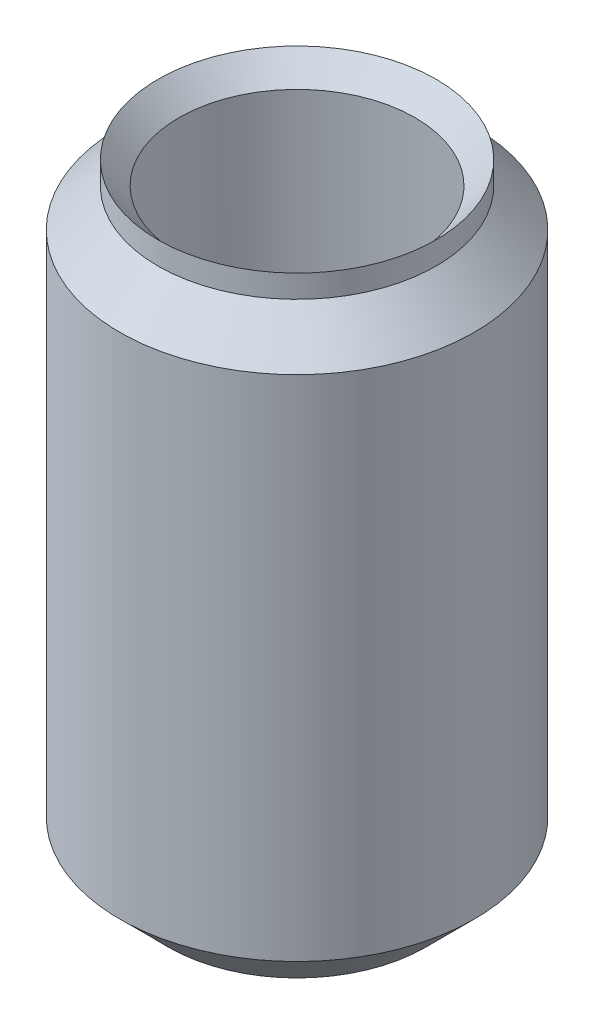
ISO-10303-21;
HEADER;
FILE_DESCRIPTION(('STEP AP214'),'2;1');
FILE_NAME('part.step','',(''),(''),'','','');
FILE_SCHEMA(('AUTOMOTIVE_DESIGN { 1 0 10303 214 1 1 1 1 }'));
ENDSEC;
DATA;
#1=APPLICATION_CONTEXT('core data for automotive mechanical design processes');
#2=APPLICATION_PROTOCOL_DEFINITION('international standard','automotive_design',2000,#1);
#3=PRODUCT_CONTEXT('',#1,'mechanical');
#4=PRODUCT('Part','Part','',(#3));
#5=PRODUCT_RELATED_PRODUCT_CATEGORY('part','',(#4));
#6=PRODUCT_DEFINITION_FORMATION('','',#4);
#7=PRODUCT_DEFINITION_CONTEXT('part definition',#1,'design');
#8=PRODUCT_DEFINITION('design','',#6,#7);
#9=PRODUCT_DEFINITION_SHAPE('','',#8);
#10=(LENGTH_UNIT() NAMED_UNIT(*) SI_UNIT(.MILLI.,.METRE.));
#11=(NAMED_UNIT(*) PLANE_ANGLE_UNIT() SI_UNIT($,.RADIAN.));
#12=(NAMED_UNIT(*) SI_UNIT($,.STERADIAN.) SOLID_ANGLE_UNIT());
#13=UNCERTAINTY_MEASURE_WITH_UNIT(LENGTH_MEASURE(1.E-05),#10,'distance_accuracy_value','');
#14=(GEOMETRIC_REPRESENTATION_CONTEXT(3) GLOBAL_UNCERTAINTY_ASSIGNED_CONTEXT((#13)) GLOBAL_UNIT_ASSIGNED_CONTEXT((#10,
#11,#12)) REPRESENTATION_CONTEXT('',''));
#15=CARTESIAN_POINT('',(0.,0.,0.));
#16=DIRECTION('',(0.,0.,1.));
#17=DIRECTION('',(1.,0.,0.));
#18=AXIS2_PLACEMENT_3D('',#15,#16,#17);
#19=CARTESIAN_POINT('',(-13.89845810231,54.0402416133194,0.));
#20=DIRECTION('',(0.,1.,0.));
#21=DIRECTION('',(0.,0.,1.));
#22=AXIS2_PLACEMENT_3D('',#19,#20,#21);
#23=CONICAL_SURFACE('',#22,21.8360141846749,0.747471825088293);
#24=CARTESIAN_POINT('',(-13.89845810231,58.2402416133193,0.));
#25=DIRECTION('',(0.,-1.,0.));
#26=DIRECTION('',(0.,0.,-1.));
#27=AXIS2_PLACEMENT_3D('',#24,#25,#26);
#28=CIRCLE('',#27,25.7289321881345);
#29=CARTESIAN_POINT('',(-13.89845810231,58.2402416133193,-25.7289321881345));
#30=VERTEX_POINT('',#29);
#31=EDGE_CURVE('E10',#30,#30,#28,.T.);
#32=ORIENTED_EDGE('',*,*,#31,.F.);
#33=EDGE_LOOP('',(#32));
#34=FACE_BOUND('',#33,.T.);
#35=CARTESIAN_POINT('',(-13.89845810231,54.0402416133194,0.));
#36=DIRECTION('',(0.,-1.,0.));
#37=DIRECTION('',(0.,0.,-1.));
#38=AXIS2_PLACEMENT_3D('',#35,#36,#37);
#39=CIRCLE('',#38,21.8360141846749);
#40=CARTESIAN_POINT('',(-13.89845810231,54.0402416133194,-21.8360141846749));
#41=VERTEX_POINT('',#40);
#42=EDGE_CURVE('E34',#41,#41,#39,.T.);
#43=ORIENTED_EDGE('',*,*,#42,.T.);
#44=EDGE_LOOP('',(#43));
#45=FACE_BOUND('',#44,.T.);
#46=ADVANCED_FACE('F31',(#34,#45),#23,.F.);
#47=CARTESIAN_POINT('',(-13.89845810231,-46.3527399541551,0.));
#48=DIRECTION('',(0.,-1.,0.));
#49=DIRECTION('',(0.,0.,-1.));
#50=AXIS2_PLACEMENT_3D('',#47,#48,#49);
#51=CYLINDRICAL_SURFACE('',#50,25.7289321881345);
#52=CARTESIAN_POINT('',(-13.89845810231,54.0402416133193,0.));
#53=DIRECTION('',(0.,-1.,0.));
#54=DIRECTION('',(0.,0.,-1.));
#55=AXIS2_PLACEMENT_3D('',#52,#53,#54);
#56=CIRCLE('',#55,25.7289321881345);
#57=CARTESIAN_POINT('',(-13.89845810231,54.0402416133193,-25.7289321881345));
#58=VERTEX_POINT('',#57);
#59=EDGE_CURVE('E38',#58,#58,#56,.T.);
#60=ORIENTED_EDGE('',*,*,#59,.F.);
#61=EDGE_LOOP('',(#60));
#62=FACE_BOUND('',#61,.T.);
#63=ORIENTED_EDGE('',*,*,#31,.T.);
#64=EDGE_LOOP('',(#63));
#65=FACE_BOUND('',#64,.T.);
#66=ADVANCED_FACE('F99',(#62,#65),#51,.T.);
#67=CARTESIAN_POINT('',(-13.89845810231,54.0402416133193,0.));
#68=DIRECTION('',(0.,-1.,0.));
#69=DIRECTION('',(0.,0.,-1.));
#70=AXIS2_PLACEMENT_3D('',#67,#68,#69);
#71=CONICAL_SURFACE('',#70,25.7289321881345,0.785398163397447);
#72=CARTESIAN_POINT('',(-13.89845810231,46.9691738014538,0.));
#73=DIRECTION('',(0.,-1.,0.));
#74=DIRECTION('',(0.,0.,-1.));
#75=AXIS2_PLACEMENT_3D('',#72,#73,#74);
#76=CIRCLE('',#75,32.8);
#77=CARTESIAN_POINT('',(-13.89845810231,46.9691738014538,-32.8));
#78=VERTEX_POINT('',#77);
#79=EDGE_CURVE('E42',#78,#78,#76,.T.);
#80=ORIENTED_EDGE('',*,*,#79,.F.);
#81=EDGE_LOOP('',(#80));
#82=FACE_BOUND('',#81,.T.);
#83=ORIENTED_EDGE('',*,*,#59,.T.);
#84=EDGE_LOOP('',(#83));
#85=FACE_BOUND('',#84,.T.);
#86=ADVANCED_FACE('F104',(#82,#85),#71,.T.);
#87=CARTESIAN_POINT('',(-13.89845810231,-46.3527399541551,0.));
#88=DIRECTION('',(0.,-1.,0.));
#89=DIRECTION('',(0.,0.,-1.));
#90=AXIS2_PLACEMENT_3D('',#87,#88,#89);
#91=CYLINDRICAL_SURFACE('',#90,32.8);
#92=CARTESIAN_POINT('',(-13.89845810231,-47.0308261985462,0.));
#93=DIRECTION('',(0.,-1.,0.));
#94=DIRECTION('',(0.,0.,-1.));
#95=AXIS2_PLACEMENT_3D('',#92,#93,#94);
#96=CIRCLE('',#95,32.8);
#97=CARTESIAN_POINT('',(-13.89845810231,-47.0308261985462,-32.8));
#98=VERTEX_POINT('',#97);
#99=EDGE_CURVE('E47',#98,#98,#96,.T.);
#100=ORIENTED_EDGE('',*,*,#99,.F.);
#101=EDGE_LOOP('',(#100));
#102=FACE_BOUND('',#101,.T.);
#103=ORIENTED_EDGE('',*,*,#79,.T.);
#104=EDGE_LOOP('',(#103));
#105=FACE_BOUND('',#104,.T.);
#106=ADVANCED_FACE('F138',(#102,#105),#91,.T.);
#107=CARTESIAN_POINT('',(-13.89845810231,-47.0308261985462,0.));
#108=DIRECTION('',(0.,1.,0.));
#109=DIRECTION('',(0.,0.,1.));
#110=AXIS2_PLACEMENT_3D('',#107,#108,#109);
#111=CONICAL_SURFACE('',#110,32.8,0.78539816339745);
#112=CARTESIAN_POINT('',(-13.89845810231,-56.0308261985462,0.));
#113=DIRECTION('',(0.,-1.,0.));
#114=DIRECTION('',(0.,0.,-1.));
#115=AXIS2_PLACEMENT_3D('',#112,#113,#114);
#116=CIRCLE('',#115,23.7999999999999);
#117=CARTESIAN_POINT('',(-13.89845810231,-56.0308261985462,-23.7999999999999));
#118=VERTEX_POINT('',#117);
#119=EDGE_CURVE('E50',#118,#118,#116,.T.);
#120=ORIENTED_EDGE('',*,*,#119,.F.);
#121=EDGE_LOOP('',(#120));
#122=FACE_BOUND('',#121,.T.);
#123=ORIENTED_EDGE('',*,*,#99,.T.);
#124=EDGE_LOOP('',(#123));
#125=FACE_BOUND('',#124,.T.);
#126=ADVANCED_FACE('F134',(#122,#125),#111,.T.);
#127=CARTESIAN_POINT('',(-13.89845810231,-56.0308261985462,0.));
#128=DIRECTION('',(0.,-1.,0.));
#129=DIRECTION('',(0.,0.,-1.));
#130=AXIS2_PLACEMENT_3D('',#127,#128,#129);
#131=CONICAL_SURFACE('',#130,23.7999999999999,0.546566963812856);
#132=CARTESIAN_POINT('',(-13.89845810231,-55.9575918137394,0.));
#133=DIRECTION('',(0.,-1.,0.));
#134=DIRECTION('',(0.,0.,-1.));
#135=AXIS2_PLACEMENT_3D('',#132,#133,#134);
#136=CIRCLE('',#135,23.7554448148378);
#137=CARTESIAN_POINT('',(-13.89845810231,-55.9575918137394,-23.7554448148378));
#138=VERTEX_POINT('',#137);
#139=EDGE_CURVE('E53',#138,#138,#136,.T.);
#140=ORIENTED_EDGE('',*,*,#139,.F.);
#141=EDGE_LOOP('',(#140));
#142=FACE_BOUND('',#141,.T.);
#143=ORIENTED_EDGE('',*,*,#119,.T.);
#144=EDGE_LOOP('',(#143));
#145=FACE_BOUND('',#144,.T.);
#146=ADVANCED_FACE('F125',(#142,#145),#131,.F.);
#147=CARTESIAN_POINT('',(-13.89845810231,-66.3527399541552,0.));
#148=DIRECTION('',(0.,-1.,0.));
#149=DIRECTION('',(0.,0.,-1.));
#150=AXIS2_PLACEMENT_3D('',#147,#148,#149);
#151=DEGENERATE_TOROIDAL_SURFACE('',#150,6.66916683691617,20.,.T.);
#152=CARTESIAN_POINT('',(-13.89845810231,-46.3527399541552,0.));
#153=DIRECTION('',(0.,-1.,0.));
#154=DIRECTION('',(0.,0.,-1.));
#155=AXIS2_PLACEMENT_3D('',#152,#153,#154);
#156=CIRCLE('',#155,6.66916683691611);
#157=CARTESIAN_POINT('',(-13.89845810231,-46.3527399541552,-6.66916683691611));
#158=VERTEX_POINT('',#157);
#159=EDGE_CURVE('E56',#158,#158,#156,.T.);
#160=ORIENTED_EDGE('',*,*,#159,.F.);
#161=EDGE_LOOP('',(#160));
#162=FACE_BOUND('',#161,.T.);
#163=ORIENTED_EDGE('',*,*,#139,.T.);
#164=EDGE_LOOP('',(#163));
#165=FACE_BOUND('',#164,.T.);
#166=ADVANCED_FACE('F119',(#162,#165),#151,.F.);
#167=CARTESIAN_POINT('',(-20.5676249392261,-46.3527399541552,0.));
#168=DIRECTION('',(0.,1.,0.));
#169=DIRECTION('',(0.,0.,1.));
#170=AXIS2_PLACEMENT_3D('',#167,#168,#169);
#171=PLANE('',#170);
#172=ORIENTED_EDGE('',*,*,#159,.T.);
#173=EDGE_LOOP('',(#172));
#174=FACE_BOUND('',#173,.T.);
#175=ADVANCED_FACE('F112',(#174),#171,.F.);
#176=CARTESIAN_POINT('',(-13.89845810231,54.0402416133194,0.));
#177=DIRECTION('',(0.,-1.,0.));
#178=DIRECTION('',(0.,0.,-1.));
#179=AXIS2_PLACEMENT_3D('',#176,#177,#178);
#180=PLANE('',#179);
#181=ORIENTED_EDGE('',*,*,#42,.F.);
#182=EDGE_LOOP('',(#181));
#183=FACE_BOUND('',#182,.T.);
#184=CARTESIAN_POINT('',(-13.89845810231,54.0402416133194,0.));
#185=DIRECTION('',(0.,-1.,0.));
#186=DIRECTION('',(0.,0.,-1.));
#187=AXIS2_PLACEMENT_3D('',#184,#185,#186);
#188=CIRCLE('',#187,21.9859985391194);
#189=CARTESIAN_POINT('',(-13.89845810231,54.0402416133194,-21.9859985391194));
#190=VERTEX_POINT('',#189);
#191=EDGE_CURVE('E64',#190,#190,#188,.T.);
#192=ORIENTED_EDGE('',*,*,#191,.T.);
#193=EDGE_LOOP('',(#192));
#194=FACE_BOUND('',#193,.T.);
#195=ADVANCED_FACE('F96',(#183,#194),#180,.T.);
#196=CARTESIAN_POINT('',(-13.89845810231,53.965465071243,0.));
#197=DIRECTION('',(0.,1.,0.));
#198=DIRECTION('',(0.,0.,1.));
#199=AXIS2_PLACEMENT_3D('',#196,#197,#198);
#200=CONICAL_SURFACE('',#199,21.9166892660513,0.747471825088293);
#201=CARTESIAN_POINT('',(-13.89845810231,57.9597491170232,0.));
#202=DIRECTION('',(0.,1.,0.));
#203=DIRECTION('',(0.,0.,1.));
#204=AXIS2_PLACEMENT_3D('',#201,#202,#203);
#205=CIRCLE('',#204,25.6189321881345);
#206=CARTESIAN_POINT('',(-13.89845810231,57.9597491170232,25.6189321881345));
#207=VERTEX_POINT('',#206);
#208=EDGE_CURVE('E67',#207,#207,#205,.F.);
#209=ORIENTED_EDGE('',*,*,#208,.T.);
#210=EDGE_LOOP('',(#209));
#211=FACE_BOUND('',#210,.T.);
#212=ORIENTED_EDGE('',*,*,#191,.F.);
#213=EDGE_LOOP('',(#212));
#214=FACE_BOUND('',#213,.T.);
#215=ADVANCED_FACE('F81',(#211,#214),#200,.T.);
#216=CARTESIAN_POINT('',(-13.89845810231,-46.3527399541551,0.));
#217=DIRECTION('',(0.,-1.,0.));
#218=DIRECTION('',(0.,0.,-1.));
#219=AXIS2_PLACEMENT_3D('',#216,#217,#218);
#220=CYLINDRICAL_SURFACE('',#219,25.6189321881345);
#221=CARTESIAN_POINT('',(-13.89845810231,53.9946781214583,0.));
#222=DIRECTION('',(0.,-1.,0.));
#223=DIRECTION('',(0.,0.,-1.));
#224=AXIS2_PLACEMENT_3D('',#221,#222,#223);
#225=CIRCLE('',#224,25.6189321881345);
#226=CARTESIAN_POINT('',(-13.89845810231,53.9946781214583,-25.6189321881345));
#227=VERTEX_POINT('',#226);
#228=EDGE_CURVE('E75',#227,#227,#225,.T.);
#229=ORIENTED_EDGE('',*,*,#228,.T.);
#230=EDGE_LOOP('',(#229));
#231=FACE_BOUND('',#230,.T.);
#232=ORIENTED_EDGE('',*,*,#208,.F.);
#233=EDGE_LOOP('',(#232));
#234=FACE_BOUND('',#233,.T.);
#235=ADVANCED_FACE('F84',(#231,#234),#220,.F.);
#236=CARTESIAN_POINT('',(-13.89845810231,53.9624598673888,0.));
#237=DIRECTION('',(0.,-1.,0.));
#238=DIRECTION('',(0.,0.,-1.));
#239=AXIS2_PLACEMENT_3D('',#236,#237,#238);
#240=CONICAL_SURFACE('',#239,25.651150442204,0.785398163397447);
#241=CARTESIAN_POINT('',(-13.89845810231,46.9236103095928,0.));
#242=DIRECTION('',(0.,-1.,0.));
#243=DIRECTION('',(0.,0.,-1.));
#244=AXIS2_PLACEMENT_3D('',#241,#242,#243);
#245=CIRCLE('',#244,32.69);
#246=CARTESIAN_POINT('',(-13.89845810231,46.9236103095928,-32.69));
#247=VERTEX_POINT('',#246);
#248=EDGE_CURVE('E72',#247,#247,#245,.T.);
#249=ORIENTED_EDGE('',*,*,#248,.T.);
#250=EDGE_LOOP('',(#249));
#251=FACE_BOUND('',#250,.T.);
#252=ORIENTED_EDGE('',*,*,#228,.F.);
#253=EDGE_LOOP('',(#252));
#254=FACE_BOUND('',#253,.T.);
#255=ADVANCED_FACE('F86',(#251,#254),#240,.F.);
#256=CARTESIAN_POINT('',(-13.89845810231,-46.3527399541551,0.));
#257=DIRECTION('',(0.,-1.,0.));
#258=DIRECTION('',(0.,0.,-1.));
#259=AXIS2_PLACEMENT_3D('',#256,#257,#258);
#260=CYLINDRICAL_SURFACE('',#259,32.69);
#261=CARTESIAN_POINT('',(-13.89845810231,-46.9852627066851,0.));
#262=DIRECTION('',(0.,1.,0.));
#263=DIRECTION('',(0.,0.,1.));
#264=AXIS2_PLACEMENT_3D('',#261,#262,#263);
#265=CIRCLE('',#264,32.69);
#266=CARTESIAN_POINT('',(-13.89845810231,-46.9852627066851,32.69));
#267=VERTEX_POINT('',#266);
#268=EDGE_CURVE('E62',#267,#267,#265,.F.);
#269=ORIENTED_EDGE('',*,*,#268,.T.);
#270=EDGE_LOOP('',(#269));
#271=FACE_BOUND('',#270,.T.);
#272=ORIENTED_EDGE('',*,*,#248,.F.);
#273=EDGE_LOOP('',(#272));
#274=FACE_BOUND('',#273,.T.);
#275=ADVANCED_FACE('F93',(#271,#274),#260,.F.);
#276=CARTESIAN_POINT('',(-13.89845810231,-46.9530444526156,0.));
#277=DIRECTION('',(0.,1.,0.));
#278=DIRECTION('',(0.,0.,1.));
#279=AXIS2_PLACEMENT_3D('',#276,#277,#278);
#280=CONICAL_SURFACE('',#279,32.7222182540695,0.78539816339745);
#281=ORIENTED_EDGE('',*,*,#268,.F.);
#282=EDGE_LOOP('',(#281));
#283=FACE_BOUND('',#282,.T.);
#284=CARTESIAN_POINT('',(-13.89845810231,-55.8541054827602,0.));
#285=DIRECTION('',(0.,-1.,0.));
#286=DIRECTION('',(0.,0.,-1.));
#287=AXIS2_PLACEMENT_3D('',#284,#285,#286);
#288=CIRCLE('',#287,23.8211572239248);
#289=CARTESIAN_POINT('',(-13.89845810231,-55.8541054827602,-23.8211572239248));
#290=VERTEX_POINT('',#289);
#291=EDGE_CURVE('E59',#290,#290,#288,.T.);
#292=ORIENTED_EDGE('',*,*,#291,.T.);
#293=EDGE_LOOP('',(#292));
#294=FACE_BOUND('',#293,.T.);
#295=ADVANCED_FACE('F202',(#283,#294),#280,.F.);
#296=CARTESIAN_POINT('',(-13.89845810231,-66.3527399541552,0.));
#297=DIRECTION('',(0.,-1.,0.));
#298=DIRECTION('',(0.,0.,-1.));
#299=AXIS2_PLACEMENT_3D('',#296,#297,#298);
#300=DEGENERATE_TOROIDAL_SURFACE('',#299,6.66916683691617,20.11,.T.);
#301=CARTESIAN_POINT('',(-13.89845810231,-46.2427399541552,0.));
#302=DIRECTION('',(0.,-1.,0.));
#303=DIRECTION('',(0.,0.,-1.));
#304=AXIS2_PLACEMENT_3D('',#301,#302,#303);
#305=CIRCLE('',#304,6.66916683691611);
#306=CARTESIAN_POINT('',(-13.89845810231,-46.2427399541552,-6.66916683691611));
#307=VERTEX_POINT('',#306);
#308=EDGE_CURVE('E63',#307,#307,#305,.T.);
#309=ORIENTED_EDGE('',*,*,#308,.T.);
#310=EDGE_LOOP('',(#309));
#311=FACE_BOUND('',#310,.T.);
#312=ORIENTED_EDGE('',*,*,#291,.F.);
#313=EDGE_LOOP('',(#312));
#314=FACE_BOUND('',#313,.T.);
#315=ADVANCED_FACE('F212',(#311,#314),#300,.T.);
#316=CARTESIAN_POINT('',(-20.5676249392261,-46.2427399541552,0.));
#317=DIRECTION('',(0.,1.,0.));
#318=DIRECTION('',(0.,0.,1.));
#319=AXIS2_PLACEMENT_3D('',#316,#317,#318);
#320=PLANE('',#319);
#321=ORIENTED_EDGE('',*,*,#308,.F.);
#322=EDGE_LOOP('',(#321));
#323=FACE_BOUND('',#322,.T.);
#324=ADVANCED_FACE('F129',(#323),#320,.T.);
#325=CLOSED_SHELL('',(#46,#66,#86,#106,#126,#146,#166,#175,#195,#215,#235,#255,#275,#295,#315,#324));
#326=MANIFOLD_SOLID_BREP('B2',#325);
#327=ADVANCED_BREP_SHAPE_REPRESENTATION('',(#18,#326),#14);
#328=SHAPE_DEFINITION_REPRESENTATION(#9,#327);
ENDSEC;
END-ISO-10303-21;
